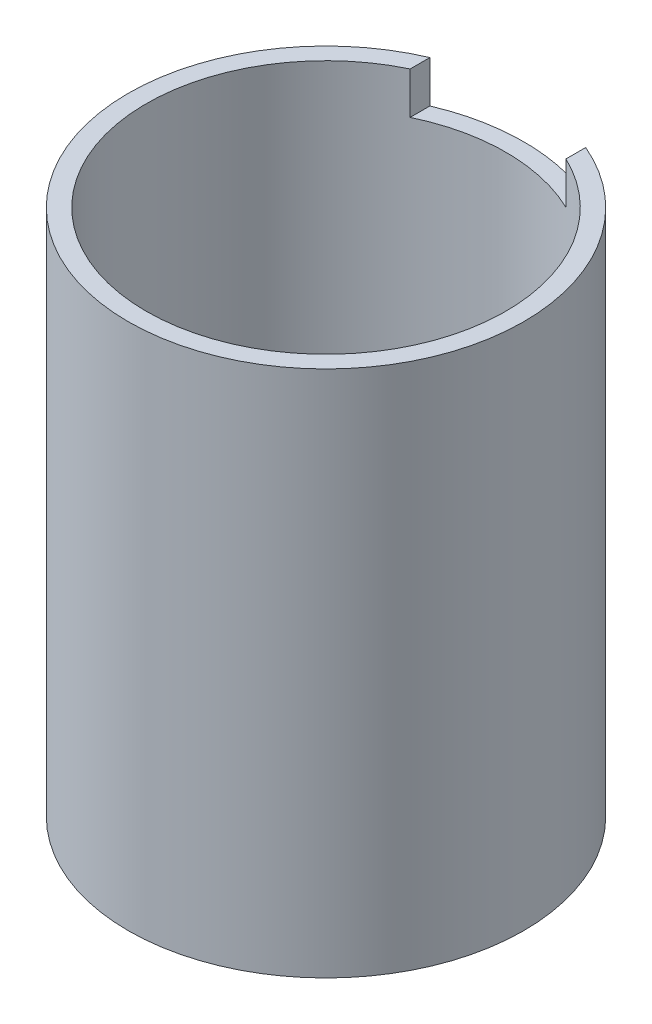
ISO-10303-21;
HEADER;
FILE_DESCRIPTION(('STEP AP214'),'2;1');
FILE_NAME('part.step','',(''),(''),'','','');
FILE_SCHEMA(('AUTOMOTIVE_DESIGN { 1 0 10303 214 1 1 1 1 }'));
ENDSEC;
DATA;
#1=APPLICATION_CONTEXT('core data for automotive mechanical design processes');
#2=APPLICATION_PROTOCOL_DEFINITION('international standard','automotive_design',2000,#1);
#3=PRODUCT_CONTEXT('',#1,'mechanical');
#4=PRODUCT('Part','Part','',(#3));
#5=PRODUCT_RELATED_PRODUCT_CATEGORY('part','',(#4));
#6=PRODUCT_DEFINITION_FORMATION('','',#4);
#7=PRODUCT_DEFINITION_CONTEXT('part definition',#1,'design');
#8=PRODUCT_DEFINITION('design','',#6,#7);
#9=PRODUCT_DEFINITION_SHAPE('','',#8);
#10=(LENGTH_UNIT() NAMED_UNIT(*) SI_UNIT(.MILLI.,.METRE.));
#11=(NAMED_UNIT(*) PLANE_ANGLE_UNIT() SI_UNIT($,.RADIAN.));
#12=(NAMED_UNIT(*) SI_UNIT($,.STERADIAN.) SOLID_ANGLE_UNIT());
#13=UNCERTAINTY_MEASURE_WITH_UNIT(LENGTH_MEASURE(1.E-05),#10,'distance_accuracy_value','');
#14=(GEOMETRIC_REPRESENTATION_CONTEXT(3) GLOBAL_UNCERTAINTY_ASSIGNED_CONTEXT((#13)) GLOBAL_UNIT_ASSIGNED_CONTEXT((#10,
#11,#12)) REPRESENTATION_CONTEXT('',''));
#15=CARTESIAN_POINT('',(0.,0.,0.));
#16=DIRECTION('',(0.,0.,1.));
#17=DIRECTION('',(1.,0.,0.));
#18=AXIS2_PLACEMENT_3D('',#15,#16,#17);
#19=CARTESIAN_POINT('',(0.,44.,0.));
#20=DIRECTION('',(0.,1.,0.));
#21=DIRECTION('',(0.,0.,1.));
#22=AXIS2_PLACEMENT_3D('',#19,#20,#21);
#23=PLANE('',#22);
#24=CARTESIAN_POINT('',(0.,44.,0.));
#25=DIRECTION('',(0.,1.,0.));
#26=DIRECTION('',(0.,0.,1.));
#27=AXIS2_PLACEMENT_3D('',#24,#25,#26);
#28=CIRCLE('',#27,16.5);
#29=CARTESIAN_POINT('',(-6.5,44.,-15.1657508881031));
#30=VERTEX_POINT('',#29);
#31=CARTESIAN_POINT('',(6.5,44.,-15.1657508881031));
#32=VERTEX_POINT('',#31);
#33=EDGE_CURVE('E122',#30,#32,#28,.T.);
#34=ORIENTED_EDGE('',*,*,#33,.T.);
#35=DIRECTION('',(0.,0.,1.));
#36=VECTOR('',#35,1.);
#37=CARTESIAN_POINT('',(6.5,44.,-44.));
#38=LINE('',#37,#36);
#39=CARTESIAN_POINT('',(6.5,44.,-13.5185058345958));
#40=VERTEX_POINT('',#39);
#41=EDGE_CURVE('E180',#32,#40,#38,.T.);
#42=ORIENTED_EDGE('',*,*,#41,.T.);
#43=CARTESIAN_POINT('',(0.,44.,0.));
#44=DIRECTION('',(0.,1.,0.));
#45=DIRECTION('',(0.,0.,1.));
#46=AXIS2_PLACEMENT_3D('',#43,#44,#45);
#47=CIRCLE('',#46,15.);
#48=CARTESIAN_POINT('',(-6.5,44.,-13.5185058345958));
#49=VERTEX_POINT('',#48);
#50=EDGE_CURVE('E136',#49,#40,#47,.T.);
#51=ORIENTED_EDGE('',*,*,#50,.F.);
#52=DIRECTION('',(0.,0.,1.));
#53=VECTOR('',#52,1.);
#54=CARTESIAN_POINT('',(-6.5,44.,-44.));
#55=LINE('',#54,#53);
#56=EDGE_CURVE('E179',#30,#49,#55,.T.);
#57=ORIENTED_EDGE('',*,*,#56,.F.);
#58=EDGE_LOOP('',(#34,#42,#51,#57));
#59=FACE_BOUND('',#58,.T.);
#60=ADVANCED_FACE('F39',(#59),#23,.T.);
#61=CARTESIAN_POINT('',(0.,0.,0.));
#62=DIRECTION('',(0.,1.,0.));
#63=DIRECTION('',(0.,0.,1.));
#64=AXIS2_PLACEMENT_3D('',#61,#62,#63);
#65=PLANE('',#64);
#66=CARTESIAN_POINT('',(0.,0.,0.));
#67=DIRECTION('',(0.,1.,0.));
#68=DIRECTION('',(0.,0.,1.));
#69=AXIS2_PLACEMENT_3D('',#66,#67,#68);
#70=CIRCLE('',#69,16.5);
#71=CARTESIAN_POINT('',(-6.5,0.,-15.1657508881031));
#72=VERTEX_POINT('',#71);
#73=CARTESIAN_POINT('',(6.5,0.,-15.1657508881031));
#74=VERTEX_POINT('',#73);
#75=EDGE_CURVE('E137',#72,#74,#70,.T.);
#76=ORIENTED_EDGE('',*,*,#75,.F.);
#77=DIRECTION('',(0.,0.,1.));
#78=VECTOR('',#77,1.);
#79=CARTESIAN_POINT('',(-6.5,0.,-44.));
#80=LINE('',#79,#78);
#81=CARTESIAN_POINT('',(-6.5,0.,-13.5185058345958));
#82=VERTEX_POINT('',#81);
#83=EDGE_CURVE('E157',#72,#82,#80,.T.);
#84=ORIENTED_EDGE('',*,*,#83,.T.);
#85=CARTESIAN_POINT('',(0.,0.,0.));
#86=DIRECTION('',(0.,1.,0.));
#87=DIRECTION('',(0.,0.,1.));
#88=AXIS2_PLACEMENT_3D('',#85,#86,#87);
#89=CIRCLE('',#88,15.);
#90=CARTESIAN_POINT('',(6.5,0.,-13.5185058345958));
#91=VERTEX_POINT('',#90);
#92=EDGE_CURVE('E134',#82,#91,#89,.T.);
#93=ORIENTED_EDGE('',*,*,#92,.T.);
#94=DIRECTION('',(0.,0.,1.));
#95=VECTOR('',#94,1.);
#96=CARTESIAN_POINT('',(6.5,0.,-44.));
#97=LINE('',#96,#95);
#98=EDGE_CURVE('E106',#74,#91,#97,.T.);
#99=ORIENTED_EDGE('',*,*,#98,.F.);
#100=EDGE_LOOP('',(#76,#84,#93,#99));
#101=FACE_BOUND('',#100,.T.);
#102=ADVANCED_FACE('F164',(#101),#65,.F.);
#103=CARTESIAN_POINT('',(0.,44.,0.));
#104=DIRECTION('',(0.,-1.,0.));
#105=DIRECTION('',(0.,0.,-1.));
#106=AXIS2_PLACEMENT_3D('',#103,#104,#105);
#107=CYLINDRICAL_SURFACE('',#106,16.5);
#108=ORIENTED_EDGE('',*,*,#75,.T.);
#109=DIRECTION('',(0.,-1.,0.));
#110=VECTOR('',#109,1.);
#111=CARTESIAN_POINT('',(6.50000000000001,44.,-15.1657508881031));
#112=LINE('',#111,#110);
#113=CARTESIAN_POINT('',(6.5,3.5,-15.1657508881031));
#114=VERTEX_POINT('',#113);
#115=EDGE_CURVE('E135',#74,#114,#112,.F.);
#116=ORIENTED_EDGE('',*,*,#115,.T.);
#117=CARTESIAN_POINT('',(0.,3.5,0.));
#118=DIRECTION('',(0.,1.,0.));
#119=DIRECTION('',(0.,0.,1.));
#120=AXIS2_PLACEMENT_3D('',#117,#118,#119);
#121=CIRCLE('',#120,16.5);
#122=CARTESIAN_POINT('',(-6.5,3.5,-15.1657508881031));
#123=VERTEX_POINT('',#122);
#124=EDGE_CURVE('E121',#114,#123,#121,.T.);
#125=ORIENTED_EDGE('',*,*,#124,.T.);
#126=DIRECTION('',(0.,-1.,0.));
#127=VECTOR('',#126,1.);
#128=CARTESIAN_POINT('',(-6.50000000000001,44.,-15.1657508881031));
#129=LINE('',#128,#127);
#130=EDGE_CURVE('E128',#123,#72,#129,.T.);
#131=ORIENTED_EDGE('',*,*,#130,.T.);
#132=EDGE_LOOP('',(#108,#116,#125,#131));
#133=FACE_BOUND('',#132,.T.);
#134=ORIENTED_EDGE('',*,*,#33,.F.);
#135=DIRECTION('',(0.,-1.,0.));
#136=VECTOR('',#135,1.);
#137=CARTESIAN_POINT('',(-6.5,44.,-15.1657508881031));
#138=LINE('',#137,#136);
#139=CARTESIAN_POINT('',(-6.5,40.5,-15.1657508881031));
#140=VERTEX_POINT('',#139);
#141=EDGE_CURVE('E114',#30,#140,#138,.T.);
#142=ORIENTED_EDGE('',*,*,#141,.T.);
#143=CARTESIAN_POINT('',(0.,40.5,0.));
#144=DIRECTION('',(0.,-1.,0.));
#145=DIRECTION('',(0.,0.,-1.));
#146=AXIS2_PLACEMENT_3D('',#143,#144,#145);
#147=CIRCLE('',#146,16.5);
#148=CARTESIAN_POINT('',(6.5,40.5,-15.1657508881031));
#149=VERTEX_POINT('',#148);
#150=EDGE_CURVE('E105',#140,#149,#147,.T.);
#151=ORIENTED_EDGE('',*,*,#150,.T.);
#152=DIRECTION('',(0.,-1.,0.));
#153=VECTOR('',#152,1.);
#154=CARTESIAN_POINT('',(6.5,44.,-15.1657508881031));
#155=LINE('',#154,#153);
#156=EDGE_CURVE('E109',#149,#32,#155,.F.);
#157=ORIENTED_EDGE('',*,*,#156,.T.);
#158=EDGE_LOOP('',(#134,#142,#151,#157));
#159=FACE_BOUND('',#158,.T.);
#160=ADVANCED_FACE('F41',(#133,#159),#107,.T.);
#161=CARTESIAN_POINT('',(0.,44.,0.));
#162=DIRECTION('',(0.,-1.,0.));
#163=DIRECTION('',(0.,0.,-1.));
#164=AXIS2_PLACEMENT_3D('',#161,#162,#163);
#165=CYLINDRICAL_SURFACE('',#164,15.);
#166=DIRECTION('',(0.,-1.,0.));
#167=VECTOR('',#166,1.);
#168=CARTESIAN_POINT('',(6.50000000000001,44.,-13.5185058345958));
#169=LINE('',#168,#167);
#170=CARTESIAN_POINT('',(6.5,3.5,-13.5185058345958));
#171=VERTEX_POINT('',#170);
#172=EDGE_CURVE('E11',#91,#171,#169,.F.);
#173=ORIENTED_EDGE('',*,*,#172,.F.);
#174=ORIENTED_EDGE('',*,*,#92,.F.);
#175=DIRECTION('',(0.,-1.,0.));
#176=VECTOR('',#175,1.);
#177=CARTESIAN_POINT('',(-6.50000000000001,44.,-13.5185058345958));
#178=LINE('',#177,#176);
#179=CARTESIAN_POINT('',(-6.5,3.5,-13.5185058345958));
#180=VERTEX_POINT('',#179);
#181=EDGE_CURVE('E50',#180,#82,#178,.T.);
#182=ORIENTED_EDGE('',*,*,#181,.F.);
#183=CARTESIAN_POINT('',(0.,3.5,0.));
#184=DIRECTION('',(0.,1.,0.));
#185=DIRECTION('',(0.,0.,1.));
#186=AXIS2_PLACEMENT_3D('',#183,#184,#185);
#187=CIRCLE('',#186,15.);
#188=EDGE_CURVE('E148',#171,#180,#187,.T.);
#189=ORIENTED_EDGE('',*,*,#188,.F.);
#190=EDGE_LOOP('',(#173,#174,#182,#189));
#191=FACE_BOUND('',#190,.T.);
#192=DIRECTION('',(0.,-1.,0.));
#193=VECTOR('',#192,1.);
#194=CARTESIAN_POINT('',(-6.5,44.,-13.5185058345958));
#195=LINE('',#194,#193);
#196=CARTESIAN_POINT('',(-6.5,40.5,-13.5185058345958));
#197=VERTEX_POINT('',#196);
#198=EDGE_CURVE('E120',#49,#197,#195,.T.);
#199=ORIENTED_EDGE('',*,*,#198,.F.);
#200=ORIENTED_EDGE('',*,*,#50,.T.);
#201=DIRECTION('',(0.,-1.,0.));
#202=VECTOR('',#201,1.);
#203=CARTESIAN_POINT('',(6.5,44.,-13.5185058345958));
#204=LINE('',#203,#202);
#205=CARTESIAN_POINT('',(6.5,40.5,-13.5185058345958));
#206=VERTEX_POINT('',#205);
#207=EDGE_CURVE('E150',#206,#40,#204,.F.);
#208=ORIENTED_EDGE('',*,*,#207,.F.);
#209=CARTESIAN_POINT('',(0.,40.5,0.));
#210=DIRECTION('',(0.,-1.,0.));
#211=DIRECTION('',(0.,0.,-1.));
#212=AXIS2_PLACEMENT_3D('',#209,#210,#211);
#213=CIRCLE('',#212,15.);
#214=EDGE_CURVE('E142',#197,#206,#213,.T.);
#215=ORIENTED_EDGE('',*,*,#214,.F.);
#216=EDGE_LOOP('',(#199,#200,#208,#215));
#217=FACE_BOUND('',#216,.T.);
#218=ADVANCED_FACE('F166',(#191,#217),#165,.F.);
#219=CARTESIAN_POINT('',(-6.5,40.5,-44.));
#220=DIRECTION('',(-1.,0.,0.));
#221=DIRECTION('',(0.,-1.,0.));
#222=AXIS2_PLACEMENT_3D('',#219,#220,#221);
#223=PLANE('',#222);
#224=ORIENTED_EDGE('',*,*,#56,.T.);
#225=ORIENTED_EDGE('',*,*,#198,.T.);
#226=DIRECTION('',(0.,0.,1.));
#227=VECTOR('',#226,1.);
#228=CARTESIAN_POINT('',(-6.5,40.5,-44.));
#229=LINE('',#228,#227);
#230=EDGE_CURVE('E62',#140,#197,#229,.T.);
#231=ORIENTED_EDGE('',*,*,#230,.F.);
#232=ORIENTED_EDGE('',*,*,#141,.F.);
#233=EDGE_LOOP('',(#224,#225,#231,#232));
#234=FACE_BOUND('',#233,.T.);
#235=ADVANCED_FACE('F111',(#234),#223,.F.);
#236=CARTESIAN_POINT('',(6.5,40.5,-44.));
#237=DIRECTION('',(1.,0.,0.));
#238=DIRECTION('',(0.,1.,0.));
#239=AXIS2_PLACEMENT_3D('',#236,#237,#238);
#240=PLANE('',#239);
#241=DIRECTION('',(0.,0.,1.));
#242=VECTOR('',#241,1.);
#243=CARTESIAN_POINT('',(6.5,40.5,-44.));
#244=LINE('',#243,#242);
#245=EDGE_CURVE('E103',#149,#206,#244,.T.);
#246=ORIENTED_EDGE('',*,*,#245,.T.);
#247=ORIENTED_EDGE('',*,*,#207,.T.);
#248=ORIENTED_EDGE('',*,*,#41,.F.);
#249=ORIENTED_EDGE('',*,*,#156,.F.);
#250=EDGE_LOOP('',(#246,#247,#248,#249));
#251=FACE_BOUND('',#250,.T.);
#252=ADVANCED_FACE('F184',(#251),#240,.F.);
#253=CARTESIAN_POINT('',(-6.5,40.5,-44.));
#254=DIRECTION('',(0.,-1.,0.));
#255=DIRECTION('',(0.,0.,-1.));
#256=AXIS2_PLACEMENT_3D('',#253,#254,#255);
#257=PLANE('',#256);
#258=ORIENTED_EDGE('',*,*,#230,.T.);
#259=ORIENTED_EDGE('',*,*,#214,.T.);
#260=ORIENTED_EDGE('',*,*,#245,.F.);
#261=ORIENTED_EDGE('',*,*,#150,.F.);
#262=EDGE_LOOP('',(#258,#259,#260,#261));
#263=FACE_BOUND('',#262,.T.);
#264=ADVANCED_FACE('F104',(#263),#257,.F.);
#265=CARTESIAN_POINT('',(6.5,3.5,-44.));
#266=DIRECTION('',(1.,0.,0.));
#267=DIRECTION('',(0.,1.,0.));
#268=AXIS2_PLACEMENT_3D('',#265,#266,#267);
#269=PLANE('',#268);
#270=ORIENTED_EDGE('',*,*,#98,.T.);
#271=ORIENTED_EDGE('',*,*,#172,.T.);
#272=DIRECTION('',(0.,0.,1.));
#273=VECTOR('',#272,1.);
#274=CARTESIAN_POINT('',(6.5,3.5,-44.));
#275=LINE('',#274,#273);
#276=EDGE_CURVE('E53',#114,#171,#275,.T.);
#277=ORIENTED_EDGE('',*,*,#276,.F.);
#278=ORIENTED_EDGE('',*,*,#115,.F.);
#279=EDGE_LOOP('',(#270,#271,#277,#278));
#280=FACE_BOUND('',#279,.T.);
#281=ADVANCED_FACE('F173',(#280),#269,.F.);
#282=CARTESIAN_POINT('',(-6.5,3.5,-44.));
#283=DIRECTION('',(-1.,0.,0.));
#284=DIRECTION('',(0.,-1.,0.));
#285=AXIS2_PLACEMENT_3D('',#282,#283,#284);
#286=PLANE('',#285);
#287=DIRECTION('',(0.,0.,1.));
#288=VECTOR('',#287,1.);
#289=CARTESIAN_POINT('',(-6.5,3.5,-44.));
#290=LINE('',#289,#288);
#291=EDGE_CURVE('E156',#123,#180,#290,.T.);
#292=ORIENTED_EDGE('',*,*,#291,.T.);
#293=ORIENTED_EDGE('',*,*,#181,.T.);
#294=ORIENTED_EDGE('',*,*,#83,.F.);
#295=ORIENTED_EDGE('',*,*,#130,.F.);
#296=EDGE_LOOP('',(#292,#293,#294,#295));
#297=FACE_BOUND('',#296,.T.);
#298=ADVANCED_FACE('F151',(#297),#286,.F.);
#299=CARTESIAN_POINT('',(-6.5,3.5,-44.));
#300=DIRECTION('',(0.,1.,0.));
#301=DIRECTION('',(0.,0.,1.));
#302=AXIS2_PLACEMENT_3D('',#299,#300,#301);
#303=PLANE('',#302);
#304=ORIENTED_EDGE('',*,*,#276,.T.);
#305=ORIENTED_EDGE('',*,*,#188,.T.);
#306=ORIENTED_EDGE('',*,*,#291,.F.);
#307=ORIENTED_EDGE('',*,*,#124,.F.);
#308=EDGE_LOOP('',(#304,#305,#306,#307));
#309=FACE_BOUND('',#308,.T.);
#310=ADVANCED_FACE('F210',(#309),#303,.F.);
#311=CLOSED_SHELL('',(#60,#102,#160,#218,#235,#252,#264,#281,#298,#310));
#312=MANIFOLD_SOLID_BREP('B2',#311);
#313=ADVANCED_BREP_SHAPE_REPRESENTATION('',(#18,#312),#14);
#314=SHAPE_DEFINITION_REPRESENTATION(#9,#313);
ENDSEC;
END-ISO-10303-21;
